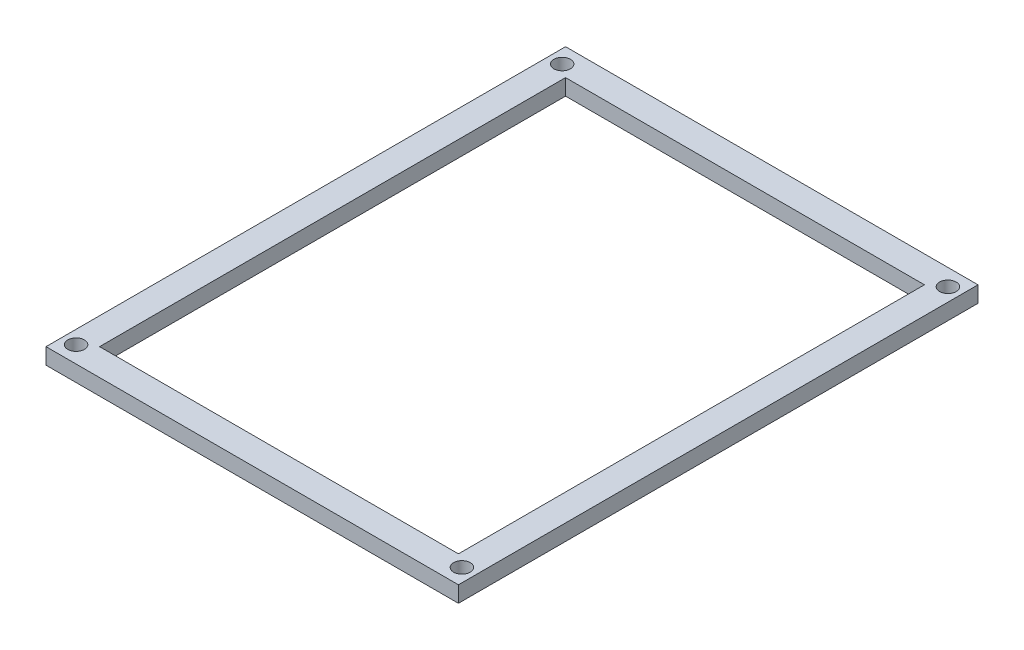
ISO-10303-21;
HEADER;
FILE_DESCRIPTION(('STEP AP214'),'2;1');
FILE_NAME('part.step','',(''),(''),'','','');
FILE_SCHEMA(('AUTOMOTIVE_DESIGN { 1 0 10303 214 1 1 1 1 }'));
ENDSEC;
DATA;
#1=APPLICATION_CONTEXT('core data for automotive mechanical design processes');
#2=APPLICATION_PROTOCOL_DEFINITION('international standard','automotive_design',2000,#1);
#3=PRODUCT_CONTEXT('',#1,'mechanical');
#4=PRODUCT('Part','Part','',(#3));
#5=PRODUCT_RELATED_PRODUCT_CATEGORY('part','',(#4));
#6=PRODUCT_DEFINITION_FORMATION('','',#4);
#7=PRODUCT_DEFINITION_CONTEXT('part definition',#1,'design');
#8=PRODUCT_DEFINITION('design','',#6,#7);
#9=PRODUCT_DEFINITION_SHAPE('','',#8);
#10=(LENGTH_UNIT() NAMED_UNIT(*) SI_UNIT(.MILLI.,.METRE.));
#11=(NAMED_UNIT(*) PLANE_ANGLE_UNIT() SI_UNIT($,.RADIAN.));
#12=(NAMED_UNIT(*) SI_UNIT($,.STERADIAN.) SOLID_ANGLE_UNIT());
#13=UNCERTAINTY_MEASURE_WITH_UNIT(LENGTH_MEASURE(1.E-05),#10,'distance_accuracy_value','');
#14=(GEOMETRIC_REPRESENTATION_CONTEXT(3) GLOBAL_UNCERTAINTY_ASSIGNED_CONTEXT((#13)) GLOBAL_UNIT_ASSIGNED_CONTEXT((#10,
#11,#12)) REPRESENTATION_CONTEXT('',''));
#15=CARTESIAN_POINT('',(0.,0.,0.));
#16=DIRECTION('',(0.,0.,1.));
#17=DIRECTION('',(1.,0.,0.));
#18=AXIS2_PLACEMENT_3D('',#15,#16,#17);
#19=CARTESIAN_POINT('',(67.,3.,0.));
#20=DIRECTION('',(-1.,0.,0.));
#21=DIRECTION('',(0.,0.,1.));
#22=AXIS2_PLACEMENT_3D('',#19,#20,#21);
#23=PLANE('',#22);
#24=DIRECTION('',(0.,0.,-1.));
#25=VECTOR('',#24,1.);
#26=CARTESIAN_POINT('',(67.,0.,0.));
#27=LINE('',#26,#25);
#28=CARTESIAN_POINT('',(67.,0.,0.));
#29=VERTEX_POINT('',#28);
#30=CARTESIAN_POINT('',(67.,0.,-87.));
#31=VERTEX_POINT('',#30);
#32=EDGE_CURVE('E161',#29,#31,#27,.T.);
#33=ORIENTED_EDGE('',*,*,#32,.F.);
#34=DIRECTION('',(0.,-1.,0.));
#35=VECTOR('',#34,1.);
#36=CARTESIAN_POINT('',(67.,3.,0.));
#37=LINE('',#36,#35);
#38=CARTESIAN_POINT('',(67.,3.,0.));
#39=VERTEX_POINT('',#38);
#40=EDGE_CURVE('E11',#39,#29,#37,.T.);
#41=ORIENTED_EDGE('',*,*,#40,.F.);
#42=DIRECTION('',(0.,0.,-1.));
#43=VECTOR('',#42,1.);
#44=CARTESIAN_POINT('',(67.,3.,0.));
#45=LINE('',#44,#43);
#46=CARTESIAN_POINT('',(67.,3.,-87.));
#47=VERTEX_POINT('',#46);
#48=EDGE_CURVE('E129',#39,#47,#45,.T.);
#49=ORIENTED_EDGE('',*,*,#48,.T.);
#50=DIRECTION('',(0.,-1.,0.));
#51=VECTOR('',#50,1.);
#52=CARTESIAN_POINT('',(67.,3.,-87.));
#53=LINE('',#52,#51);
#54=EDGE_CURVE('E91',#47,#31,#53,.T.);
#55=ORIENTED_EDGE('',*,*,#54,.T.);
#56=EDGE_LOOP('',(#33,#41,#49,#55));
#57=FACE_BOUND('',#56,.T.);
#58=ADVANCED_FACE('F37',(#57),#23,.T.);
#59=CARTESIAN_POINT('',(0.,3.,0.));
#60=DIRECTION('',(0.,0.,-1.));
#61=DIRECTION('',(-1.,0.,0.));
#62=AXIS2_PLACEMENT_3D('',#59,#60,#61);
#63=PLANE('',#62);
#64=DIRECTION('',(1.,0.,0.));
#65=VECTOR('',#64,1.);
#66=CARTESIAN_POINT('',(0.,0.,0.));
#67=LINE('',#66,#65);
#68=CARTESIAN_POINT('',(0.,0.,0.));
#69=VERTEX_POINT('',#68);
#70=EDGE_CURVE('E119',#69,#29,#67,.T.);
#71=ORIENTED_EDGE('',*,*,#70,.F.);
#72=DIRECTION('',(0.,-1.,0.));
#73=VECTOR('',#72,1.);
#74=CARTESIAN_POINT('',(0.,3.,0.));
#75=LINE('',#74,#73);
#76=CARTESIAN_POINT('',(0.,3.,0.));
#77=VERTEX_POINT('',#76);
#78=EDGE_CURVE('E47',#77,#69,#75,.T.);
#79=ORIENTED_EDGE('',*,*,#78,.F.);
#80=DIRECTION('',(1.,0.,0.));
#81=VECTOR('',#80,1.);
#82=CARTESIAN_POINT('',(0.,3.,0.));
#83=LINE('',#82,#81);
#84=EDGE_CURVE('E117',#77,#39,#83,.T.);
#85=ORIENTED_EDGE('',*,*,#84,.T.);
#86=ORIENTED_EDGE('',*,*,#40,.T.);
#87=EDGE_LOOP('',(#71,#79,#85,#86));
#88=FACE_BOUND('',#87,.T.);
#89=ADVANCED_FACE('F115',(#88),#63,.T.);
#90=CARTESIAN_POINT('',(0.,3.,0.));
#91=DIRECTION('',(-1.,0.,0.));
#92=DIRECTION('',(0.,0.,1.));
#93=AXIS2_PLACEMENT_3D('',#90,#91,#92);
#94=PLANE('',#93);
#95=DIRECTION('',(0.,0.,-1.));
#96=VECTOR('',#95,1.);
#97=CARTESIAN_POINT('',(0.,0.,0.));
#98=LINE('',#97,#96);
#99=CARTESIAN_POINT('',(0.,0.,-87.));
#100=VERTEX_POINT('',#99);
#101=EDGE_CURVE('E164',#69,#100,#98,.T.);
#102=ORIENTED_EDGE('',*,*,#101,.T.);
#103=DIRECTION('',(0.,-1.,0.));
#104=VECTOR('',#103,1.);
#105=CARTESIAN_POINT('',(0.,3.,-87.));
#106=LINE('',#105,#104);
#107=CARTESIAN_POINT('',(0.,3.,-87.));
#108=VERTEX_POINT('',#107);
#109=EDGE_CURVE('E122',#108,#100,#106,.T.);
#110=ORIENTED_EDGE('',*,*,#109,.F.);
#111=DIRECTION('',(0.,0.,-1.));
#112=VECTOR('',#111,1.);
#113=CARTESIAN_POINT('',(0.,3.,0.));
#114=LINE('',#113,#112);
#115=EDGE_CURVE('E125',#77,#108,#114,.T.);
#116=ORIENTED_EDGE('',*,*,#115,.F.);
#117=ORIENTED_EDGE('',*,*,#78,.T.);
#118=EDGE_LOOP('',(#102,#110,#116,#117));
#119=FACE_BOUND('',#118,.T.);
#120=ADVANCED_FACE('F126',(#119),#94,.F.);
#121=CARTESIAN_POINT('',(-5.,3.,0.));
#122=DIRECTION('',(-1.,0.,0.));
#123=DIRECTION('',(0.,0.,1.));
#124=AXIS2_PLACEMENT_3D('',#121,#122,#123);
#125=PLANE('',#124);
#126=DIRECTION('',(0.,0.,-1.));
#127=VECTOR('',#126,1.);
#128=CARTESIAN_POINT('',(-5.,0.,0.));
#129=LINE('',#128,#127);
#130=CARTESIAN_POINT('',(-5.,0.,5.));
#131=VERTEX_POINT('',#130);
#132=CARTESIAN_POINT('',(-5.,0.,-92.));
#133=VERTEX_POINT('',#132);
#134=EDGE_CURVE('E149',#131,#133,#129,.T.);
#135=ORIENTED_EDGE('',*,*,#134,.F.);
#136=DIRECTION('',(0.,-1.,0.));
#137=VECTOR('',#136,1.);
#138=CARTESIAN_POINT('',(-5.,3.,5.));
#139=LINE('',#138,#137);
#140=CARTESIAN_POINT('',(-5.,3.,5.));
#141=VERTEX_POINT('',#140);
#142=EDGE_CURVE('E41',#141,#131,#139,.T.);
#143=ORIENTED_EDGE('',*,*,#142,.F.);
#144=DIRECTION('',(0.,0.,-1.));
#145=VECTOR('',#144,1.);
#146=CARTESIAN_POINT('',(-5.,3.,0.));
#147=LINE('',#146,#145);
#148=CARTESIAN_POINT('',(-5.,3.,-92.));
#149=VERTEX_POINT('',#148);
#150=EDGE_CURVE('E186',#141,#149,#147,.T.);
#151=ORIENTED_EDGE('',*,*,#150,.T.);
#152=DIRECTION('',(0.,-1.,0.));
#153=VECTOR('',#152,1.);
#154=CARTESIAN_POINT('',(-5.,3.,-92.));
#155=LINE('',#154,#153);
#156=EDGE_CURVE('E136',#149,#133,#155,.T.);
#157=ORIENTED_EDGE('',*,*,#156,.T.);
#158=EDGE_LOOP('',(#135,#143,#151,#157));
#159=FACE_BOUND('',#158,.T.);
#160=ADVANCED_FACE('F185',(#159),#125,.T.);
#161=CARTESIAN_POINT('',(0.,3.,5.));
#162=DIRECTION('',(0.,0.,-1.));
#163=DIRECTION('',(-1.,0.,0.));
#164=AXIS2_PLACEMENT_3D('',#161,#162,#163);
#165=PLANE('',#164);
#166=DIRECTION('',(1.,0.,0.));
#167=VECTOR('',#166,1.);
#168=CARTESIAN_POINT('',(0.,0.,5.));
#169=LINE('',#168,#167);
#170=CARTESIAN_POINT('',(72.,0.,5.));
#171=VERTEX_POINT('',#170);
#172=EDGE_CURVE('E152',#131,#171,#169,.T.);
#173=ORIENTED_EDGE('',*,*,#172,.T.);
#174=DIRECTION('',(0.,-1.,0.));
#175=VECTOR('',#174,1.);
#176=CARTESIAN_POINT('',(72.,3.,5.));
#177=LINE('',#176,#175);
#178=CARTESIAN_POINT('',(72.,3.,5.));
#179=VERTEX_POINT('',#178);
#180=EDGE_CURVE('E172',#179,#171,#177,.T.);
#181=ORIENTED_EDGE('',*,*,#180,.F.);
#182=DIRECTION('',(1.,0.,0.));
#183=VECTOR('',#182,1.);
#184=CARTESIAN_POINT('',(0.,3.,5.));
#185=LINE('',#184,#183);
#186=EDGE_CURVE('E180',#141,#179,#185,.T.);
#187=ORIENTED_EDGE('',*,*,#186,.F.);
#188=ORIENTED_EDGE('',*,*,#142,.T.);
#189=EDGE_LOOP('',(#173,#181,#187,#188));
#190=FACE_BOUND('',#189,.T.);
#191=ADVANCED_FACE('F178',(#190),#165,.F.);
#192=CARTESIAN_POINT('',(72.,3.,0.));
#193=DIRECTION('',(-1.,0.,0.));
#194=DIRECTION('',(0.,0.,1.));
#195=AXIS2_PLACEMENT_3D('',#192,#193,#194);
#196=PLANE('',#195);
#197=DIRECTION('',(0.,0.,-1.));
#198=VECTOR('',#197,1.);
#199=CARTESIAN_POINT('',(72.,0.,0.));
#200=LINE('',#199,#198);
#201=CARTESIAN_POINT('',(72.,0.,-92.));
#202=VERTEX_POINT('',#201);
#203=EDGE_CURVE('E155',#171,#202,#200,.T.);
#204=ORIENTED_EDGE('',*,*,#203,.T.);
#205=DIRECTION('',(0.,-1.,0.));
#206=VECTOR('',#205,1.);
#207=CARTESIAN_POINT('',(72.,3.,-92.));
#208=LINE('',#207,#206);
#209=CARTESIAN_POINT('',(72.,3.,-92.));
#210=VERTEX_POINT('',#209);
#211=EDGE_CURVE('E171',#210,#202,#208,.T.);
#212=ORIENTED_EDGE('',*,*,#211,.F.);
#213=DIRECTION('',(0.,0.,-1.));
#214=VECTOR('',#213,1.);
#215=CARTESIAN_POINT('',(72.,3.,0.));
#216=LINE('',#215,#214);
#217=EDGE_CURVE('E238',#179,#210,#216,.T.);
#218=ORIENTED_EDGE('',*,*,#217,.F.);
#219=ORIENTED_EDGE('',*,*,#180,.T.);
#220=EDGE_LOOP('',(#204,#212,#218,#219));
#221=FACE_BOUND('',#220,.T.);
#222=ADVANCED_FACE('F192',(#221),#196,.F.);
#223=CARTESIAN_POINT('',(0.,3.,-92.));
#224=DIRECTION('',(0.,0.,-1.));
#225=DIRECTION('',(-1.,0.,0.));
#226=AXIS2_PLACEMENT_3D('',#223,#224,#225);
#227=PLANE('',#226);
#228=DIRECTION('',(1.,0.,0.));
#229=VECTOR('',#228,1.);
#230=CARTESIAN_POINT('',(0.,0.,-92.));
#231=LINE('',#230,#229);
#232=EDGE_CURVE('E158',#133,#202,#231,.T.);
#233=ORIENTED_EDGE('',*,*,#232,.F.);
#234=ORIENTED_EDGE('',*,*,#156,.F.);
#235=DIRECTION('',(1.,0.,0.));
#236=VECTOR('',#235,1.);
#237=CARTESIAN_POINT('',(0.,3.,-92.));
#238=LINE('',#237,#236);
#239=EDGE_CURVE('E131',#149,#210,#238,.T.);
#240=ORIENTED_EDGE('',*,*,#239,.T.);
#241=ORIENTED_EDGE('',*,*,#211,.T.);
#242=EDGE_LOOP('',(#233,#234,#240,#241));
#243=FACE_BOUND('',#242,.T.);
#244=ADVANCED_FACE('F190',(#243),#227,.T.);
#245=CARTESIAN_POINT('',(69.5130540320002,3.,-88.8670940403119));
#246=DIRECTION('',(0.,-1.,0.));
#247=DIRECTION('',(0.,0.,-1.));
#248=AXIS2_PLACEMENT_3D('',#245,#246,#247);
#249=CYLINDRICAL_SURFACE('',#248,1.54999999999999);
#250=CARTESIAN_POINT('',(69.5130540320002,3.,-88.8670940403119));
#251=DIRECTION('',(0.,1.,0.));
#252=DIRECTION('',(0.,0.,1.));
#253=AXIS2_PLACEMENT_3D('',#250,#251,#252);
#254=CIRCLE('',#253,1.54999999999999);
#255=CARTESIAN_POINT('',(69.5130540320002,3.,-87.3170940403119));
#256=VERTEX_POINT('',#255);
#257=EDGE_CURVE('E236',#256,#256,#254,.T.);
#258=ORIENTED_EDGE('',*,*,#257,.T.);
#259=EDGE_LOOP('',(#258));
#260=FACE_BOUND('',#259,.T.);
#261=CARTESIAN_POINT('',(69.5130540320002,0.,-88.8670940403119));
#262=DIRECTION('',(0.,1.,0.));
#263=DIRECTION('',(0.,0.,1.));
#264=AXIS2_PLACEMENT_3D('',#261,#262,#263);
#265=CIRCLE('',#264,1.54999999999999);
#266=CARTESIAN_POINT('',(69.5130540320002,0.,-87.3170940403119));
#267=VERTEX_POINT('',#266);
#268=EDGE_CURVE('E146',#267,#267,#265,.T.);
#269=ORIENTED_EDGE('',*,*,#268,.F.);
#270=EDGE_LOOP('',(#269));
#271=FACE_BOUND('',#270,.T.);
#272=ADVANCED_FACE('F199',(#260,#271),#249,.F.);
#273=CARTESIAN_POINT('',(-2.51305403200015,3.,-88.8670940403119));
#274=DIRECTION('',(0.,-1.,0.));
#275=DIRECTION('',(0.,0.,-1.));
#276=AXIS2_PLACEMENT_3D('',#273,#274,#275);
#277=CYLINDRICAL_SURFACE('',#276,1.54999999999999);
#278=CARTESIAN_POINT('',(-2.51305403200015,3.,-88.8670940403119));
#279=DIRECTION('',(0.,1.,0.));
#280=DIRECTION('',(0.,0.,1.));
#281=AXIS2_PLACEMENT_3D('',#278,#279,#280);
#282=CIRCLE('',#281,1.54999999999999);
#283=CARTESIAN_POINT('',(-2.51305403200015,3.,-87.3170940403119));
#284=VERTEX_POINT('',#283);
#285=EDGE_CURVE('E232',#284,#284,#282,.T.);
#286=ORIENTED_EDGE('',*,*,#285,.T.);
#287=EDGE_LOOP('',(#286));
#288=FACE_BOUND('',#287,.T.);
#289=CARTESIAN_POINT('',(-2.51305403200015,0.,-88.8670940403119));
#290=DIRECTION('',(0.,1.,0.));
#291=DIRECTION('',(0.,0.,1.));
#292=AXIS2_PLACEMENT_3D('',#289,#290,#291);
#293=CIRCLE('',#292,1.54999999999999);
#294=CARTESIAN_POINT('',(-2.51305403200015,0.,-87.3170940403119));
#295=VERTEX_POINT('',#294);
#296=EDGE_CURVE('E143',#295,#295,#293,.T.);
#297=ORIENTED_EDGE('',*,*,#296,.F.);
#298=EDGE_LOOP('',(#297));
#299=FACE_BOUND('',#298,.T.);
#300=ADVANCED_FACE('F258',(#288,#299),#277,.F.);
#301=CARTESIAN_POINT('',(-2.51305403200016,3.,1.86709404031189));
#302=DIRECTION('',(0.,-1.,0.));
#303=DIRECTION('',(0.,0.,-1.));
#304=AXIS2_PLACEMENT_3D('',#301,#302,#303);
#305=CYLINDRICAL_SURFACE('',#304,1.55);
#306=CARTESIAN_POINT('',(-2.51305403200016,3.,1.86709404031189));
#307=DIRECTION('',(0.,1.,0.));
#308=DIRECTION('',(0.,0.,1.));
#309=AXIS2_PLACEMENT_3D('',#306,#307,#308);
#310=CIRCLE('',#309,1.55);
#311=CARTESIAN_POINT('',(-2.51305403200016,3.,3.41709404031189));
#312=VERTEX_POINT('',#311);
#313=EDGE_CURVE('E228',#312,#312,#310,.T.);
#314=ORIENTED_EDGE('',*,*,#313,.T.);
#315=EDGE_LOOP('',(#314));
#316=FACE_BOUND('',#315,.T.);
#317=CARTESIAN_POINT('',(-2.51305403200016,0.,1.86709404031189));
#318=DIRECTION('',(0.,1.,0.));
#319=DIRECTION('',(0.,0.,1.));
#320=AXIS2_PLACEMENT_3D('',#317,#318,#319);
#321=CIRCLE('',#320,1.55);
#322=CARTESIAN_POINT('',(-2.51305403200016,0.,3.41709404031189));
#323=VERTEX_POINT('',#322);
#324=EDGE_CURVE('E140',#323,#323,#321,.T.);
#325=ORIENTED_EDGE('',*,*,#324,.F.);
#326=EDGE_LOOP('',(#325));
#327=FACE_BOUND('',#326,.T.);
#328=ADVANCED_FACE('F248',(#316,#327),#305,.F.);
#329=CARTESIAN_POINT('',(69.5130540320002,3.,1.86709404031188));
#330=DIRECTION('',(0.,-1.,0.));
#331=DIRECTION('',(0.,0.,-1.));
#332=AXIS2_PLACEMENT_3D('',#329,#330,#331);
#333=CYLINDRICAL_SURFACE('',#332,1.54999999999999);
#334=CARTESIAN_POINT('',(69.5130540320002,3.,1.86709404031188));
#335=DIRECTION('',(0.,1.,0.));
#336=DIRECTION('',(0.,0.,1.));
#337=AXIS2_PLACEMENT_3D('',#334,#335,#336);
#338=CIRCLE('',#337,1.54999999999999);
#339=CARTESIAN_POINT('',(69.5130540320002,3.,3.41709404031188));
#340=VERTEX_POINT('',#339);
#341=EDGE_CURVE('E167',#340,#340,#338,.T.);
#342=ORIENTED_EDGE('',*,*,#341,.T.);
#343=EDGE_LOOP('',(#342));
#344=FACE_BOUND('',#343,.T.);
#345=CARTESIAN_POINT('',(69.5130540320002,0.,1.86709404031188));
#346=DIRECTION('',(0.,1.,0.));
#347=DIRECTION('',(0.,0.,1.));
#348=AXIS2_PLACEMENT_3D('',#345,#346,#347);
#349=CIRCLE('',#348,1.54999999999999);
#350=CARTESIAN_POINT('',(69.5130540320002,0.,3.41709404031188));
#351=VERTEX_POINT('',#350);
#352=EDGE_CURVE('E137',#351,#351,#349,.T.);
#353=ORIENTED_EDGE('',*,*,#352,.F.);
#354=EDGE_LOOP('',(#353));
#355=FACE_BOUND('',#354,.T.);
#356=ADVANCED_FACE('F39',(#344,#355),#333,.F.);
#357=CARTESIAN_POINT('',(0.,3.,-87.));
#358=DIRECTION('',(0.,0.,-1.));
#359=DIRECTION('',(-1.,0.,0.));
#360=AXIS2_PLACEMENT_3D('',#357,#358,#359);
#361=PLANE('',#360);
#362=DIRECTION('',(1.,0.,0.));
#363=VECTOR('',#362,1.);
#364=CARTESIAN_POINT('',(0.,0.,-87.));
#365=LINE('',#364,#363);
#366=EDGE_CURVE('E84',#100,#31,#365,.T.);
#367=ORIENTED_EDGE('',*,*,#366,.T.);
#368=ORIENTED_EDGE('',*,*,#54,.F.);
#369=DIRECTION('',(1.,0.,0.));
#370=VECTOR('',#369,1.);
#371=CARTESIAN_POINT('',(0.,3.,-87.));
#372=LINE('',#371,#370);
#373=EDGE_CURVE('E56',#108,#47,#372,.T.);
#374=ORIENTED_EDGE('',*,*,#373,.F.);
#375=ORIENTED_EDGE('',*,*,#109,.T.);
#376=EDGE_LOOP('',(#367,#368,#374,#375));
#377=FACE_BOUND('',#376,.T.);
#378=ADVANCED_FACE('F211',(#377),#361,.F.);
#379=CARTESIAN_POINT('',(0.,3.,0.));
#380=DIRECTION('',(0.,1.,0.));
#381=DIRECTION('',(0.,0.,1.));
#382=AXIS2_PLACEMENT_3D('',#379,#380,#381);
#383=PLANE('',#382);
#384=ORIENTED_EDGE('',*,*,#341,.F.);
#385=EDGE_LOOP('',(#384));
#386=FACE_BOUND('',#385,.T.);
#387=ORIENTED_EDGE('',*,*,#313,.F.);
#388=EDGE_LOOP('',(#387));
#389=FACE_BOUND('',#388,.T.);
#390=ORIENTED_EDGE('',*,*,#285,.F.);
#391=EDGE_LOOP('',(#390));
#392=FACE_BOUND('',#391,.T.);
#393=ORIENTED_EDGE('',*,*,#257,.F.);
#394=EDGE_LOOP('',(#393));
#395=FACE_BOUND('',#394,.T.);
#396=ORIENTED_EDGE('',*,*,#150,.F.);
#397=ORIENTED_EDGE('',*,*,#186,.T.);
#398=ORIENTED_EDGE('',*,*,#217,.T.);
#399=ORIENTED_EDGE('',*,*,#239,.F.);
#400=EDGE_LOOP('',(#396,#397,#398,#399));
#401=FACE_BOUND('',#400,.T.);
#402=ORIENTED_EDGE('',*,*,#48,.F.);
#403=ORIENTED_EDGE('',*,*,#84,.F.);
#404=ORIENTED_EDGE('',*,*,#115,.T.);
#405=ORIENTED_EDGE('',*,*,#373,.T.);
#406=EDGE_LOOP('',(#402,#403,#404,#405));
#407=FACE_BOUND('',#406,.T.);
#408=ADVANCED_FACE('F128',(#386,#389,#392,#395,#401,#407),#383,.T.);
#409=CARTESIAN_POINT('',(0.,0.,0.));
#410=DIRECTION('',(0.,1.,0.));
#411=DIRECTION('',(0.,0.,1.));
#412=AXIS2_PLACEMENT_3D('',#409,#410,#411);
#413=PLANE('',#412);
#414=ORIENTED_EDGE('',*,*,#352,.T.);
#415=EDGE_LOOP('',(#414));
#416=FACE_BOUND('',#415,.T.);
#417=ORIENTED_EDGE('',*,*,#324,.T.);
#418=EDGE_LOOP('',(#417));
#419=FACE_BOUND('',#418,.T.);
#420=ORIENTED_EDGE('',*,*,#296,.T.);
#421=EDGE_LOOP('',(#420));
#422=FACE_BOUND('',#421,.T.);
#423=ORIENTED_EDGE('',*,*,#268,.T.);
#424=EDGE_LOOP('',(#423));
#425=FACE_BOUND('',#424,.T.);
#426=ORIENTED_EDGE('',*,*,#134,.T.);
#427=ORIENTED_EDGE('',*,*,#232,.T.);
#428=ORIENTED_EDGE('',*,*,#203,.F.);
#429=ORIENTED_EDGE('',*,*,#172,.F.);
#430=EDGE_LOOP('',(#426,#427,#428,#429));
#431=FACE_BOUND('',#430,.T.);
#432=ORIENTED_EDGE('',*,*,#32,.T.);
#433=ORIENTED_EDGE('',*,*,#366,.F.);
#434=ORIENTED_EDGE('',*,*,#101,.F.);
#435=ORIENTED_EDGE('',*,*,#70,.T.);
#436=EDGE_LOOP('',(#432,#433,#434,#435));
#437=FACE_BOUND('',#436,.T.);
#438=ADVANCED_FACE('F183',(#416,#419,#422,#425,#431,#437),#413,.F.);
#439=CLOSED_SHELL('',(#58,#89,#120,#160,#191,#222,#244,#272,#300,#328,#356,#378,#408,#438));
#440=MANIFOLD_SOLID_BREP('B2',#439);
#441=ADVANCED_BREP_SHAPE_REPRESENTATION('',(#18,#440),#14);
#442=SHAPE_DEFINITION_REPRESENTATION(#9,#441);
ENDSEC;
END-ISO-10303-21;
